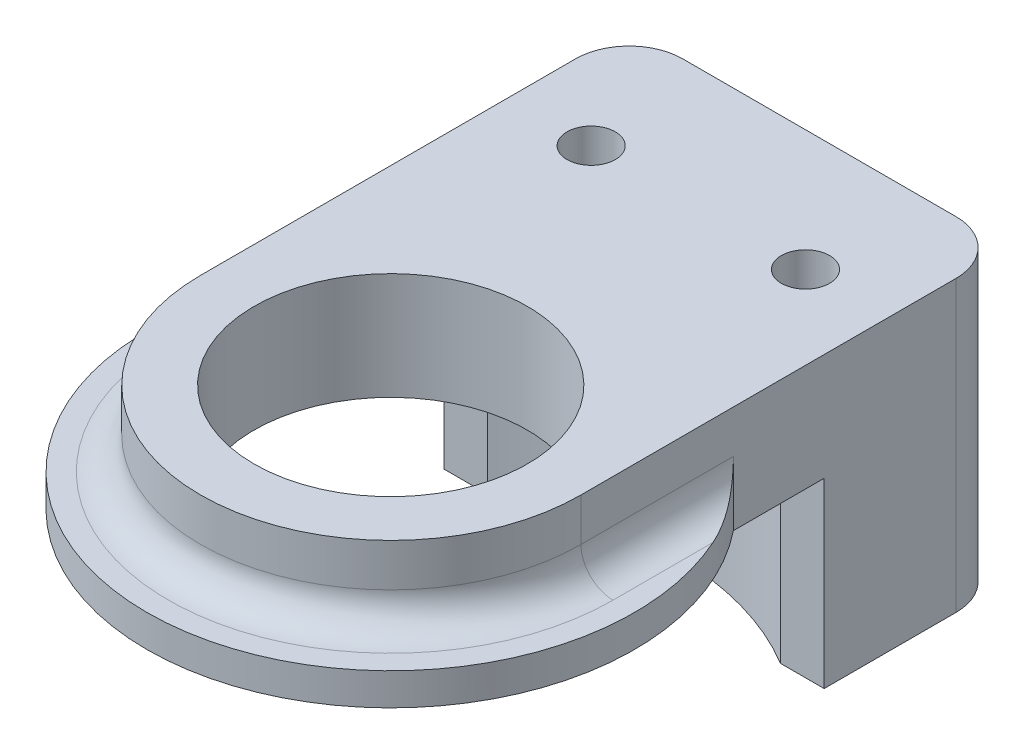
ISO-10303-21;
HEADER;
FILE_DESCRIPTION(('STEP AP214'),'2;1');
FILE_NAME('part.step','',(''),(''),'','','');
FILE_SCHEMA(('AUTOMOTIVE_DESIGN { 1 0 10303 214 1 1 1 1 }'));
ENDSEC;
DATA;
#1=APPLICATION_CONTEXT('core data for automotive mechanical design processes');
#2=APPLICATION_PROTOCOL_DEFINITION('international standard','automotive_design',2000,#1);
#3=PRODUCT_CONTEXT('',#1,'mechanical');
#4=PRODUCT('Part','Part','',(#3));
#5=PRODUCT_RELATED_PRODUCT_CATEGORY('part','',(#4));
#6=PRODUCT_DEFINITION_FORMATION('','',#4);
#7=PRODUCT_DEFINITION_CONTEXT('part definition',#1,'design');
#8=PRODUCT_DEFINITION('design','',#6,#7);
#9=PRODUCT_DEFINITION_SHAPE('','',#8);
#10=(LENGTH_UNIT() NAMED_UNIT(*) SI_UNIT(.MILLI.,.METRE.));
#11=(NAMED_UNIT(*) PLANE_ANGLE_UNIT() SI_UNIT($,.RADIAN.));
#12=(NAMED_UNIT(*) SI_UNIT($,.STERADIAN.) SOLID_ANGLE_UNIT());
#13=UNCERTAINTY_MEASURE_WITH_UNIT(LENGTH_MEASURE(1.E-05),#10,'distance_accuracy_value','');
#14=(GEOMETRIC_REPRESENTATION_CONTEXT(3) GLOBAL_UNCERTAINTY_ASSIGNED_CONTEXT((#13)) GLOBAL_UNIT_ASSIGNED_CONTEXT((#10,
#11,#12)) REPRESENTATION_CONTEXT('',''));
#15=CARTESIAN_POINT('',(0.,0.,0.));
#16=DIRECTION('',(0.,0.,1.));
#17=DIRECTION('',(1.,0.,0.));
#18=AXIS2_PLACEMENT_3D('',#15,#16,#17);
#19=CARTESIAN_POINT('',(17.75,-17.,-22.7));
#20=DIRECTION('',(0.,0.,-1.));
#21=DIRECTION('',(-1.,0.,0.));
#22=AXIS2_PLACEMENT_3D('',#19,#20,#21);
#23=PLANE('',#22);
#24=DIRECTION('',(0.,1.,0.));
#25=VECTOR('',#24,1.);
#26=CARTESIAN_POINT('',(-13.6733317081098,-30.,-22.7));
#27=LINE('',#26,#25);
#28=CARTESIAN_POINT('',(-13.6733317081098,0.,-22.7));
#29=VERTEX_POINT('',#28);
#30=CARTESIAN_POINT('',(-13.6733317081098,-17.,-22.7));
#31=VERTEX_POINT('',#30);
#32=EDGE_CURVE('E11',#29,#31,#27,.F.);
#33=ORIENTED_EDGE('',*,*,#32,.F.);
#34=DIRECTION('',(-1.,0.,0.));
#35=VECTOR('',#34,1.);
#36=CARTESIAN_POINT('',(17.75,0.,-22.7));
#37=LINE('',#36,#35);
#38=CARTESIAN_POINT('',(-17.75,0.,-22.7));
#39=VERTEX_POINT('',#38);
#40=EDGE_CURVE('E143',#29,#39,#37,.T.);
#41=ORIENTED_EDGE('',*,*,#40,.T.);
#42=DIRECTION('',(0.,1.,0.));
#43=VECTOR('',#42,1.);
#44=CARTESIAN_POINT('',(-17.75,-17.,-22.7));
#45=LINE('',#44,#43);
#46=CARTESIAN_POINT('',(-17.75,-17.,-22.7));
#47=VERTEX_POINT('',#46);
#48=EDGE_CURVE('E164',#47,#39,#45,.T.);
#49=ORIENTED_EDGE('',*,*,#48,.F.);
#50=DIRECTION('',(-1.,0.,0.));
#51=VECTOR('',#50,1.);
#52=CARTESIAN_POINT('',(17.75,-17.,-22.7));
#53=LINE('',#52,#51);
#54=EDGE_CURVE('E145',#31,#47,#53,.T.);
#55=ORIENTED_EDGE('',*,*,#54,.F.);
#56=EDGE_LOOP('',(#33,#41,#49,#55));
#57=FACE_BOUND('',#56,.T.);
#58=ADVANCED_FACE('F33',(#57),#23,.F.);
#59=DIRECTION('',(0.,1.,0.));
#60=VECTOR('',#59,1.);
#61=CARTESIAN_POINT('',(13.6733317081098,-30.,-22.7));
#62=LINE('',#61,#60);
#63=CARTESIAN_POINT('',(13.6733317081098,-17.,-22.7));
#64=VERTEX_POINT('',#63);
#65=CARTESIAN_POINT('',(13.6733317081098,0.,-22.7));
#66=VERTEX_POINT('',#65);
#67=EDGE_CURVE('E42',#64,#66,#62,.T.);
#68=ORIENTED_EDGE('',*,*,#67,.F.);
#69=CARTESIAN_POINT('',(17.75,-17.,-22.7));
#70=VERTEX_POINT('',#69);
#71=EDGE_CURVE('E355',#70,#64,#53,.T.);
#72=ORIENTED_EDGE('',*,*,#71,.F.);
#73=DIRECTION('',(0.,1.,0.));
#74=VECTOR('',#73,1.);
#75=CARTESIAN_POINT('',(17.75,-17.,-22.7));
#76=LINE('',#75,#74);
#77=CARTESIAN_POINT('',(17.75,0.,-22.7));
#78=VERTEX_POINT('',#77);
#79=EDGE_CURVE('E161',#70,#78,#76,.T.);
#80=ORIENTED_EDGE('',*,*,#79,.T.);
#81=EDGE_CURVE('E151',#78,#66,#37,.T.);
#82=ORIENTED_EDGE('',*,*,#81,.T.);
#83=EDGE_LOOP('',(#68,#72,#80,#82));
#84=FACE_BOUND('',#83,.T.);
#85=ADVANCED_FACE('F268',(#84),#23,.F.);
#86=CARTESIAN_POINT('',(0.,0.,0.));
#87=DIRECTION('',(0.,1.,0.));
#88=DIRECTION('',(0.,0.,1.));
#89=AXIS2_PLACEMENT_3D('',#86,#87,#88);
#90=PLANE('',#89);
#91=ORIENTED_EDGE('',*,*,#81,.F.);
#92=DIRECTION('',(0.,0.,-1.));
#93=VECTOR('',#92,1.);
#94=CARTESIAN_POINT('',(17.75,0.,-40.));
#95=LINE('',#94,#93);
#96=CARTESIAN_POINT('',(17.75,0.,-14.2302494707577));
#97=VERTEX_POINT('',#96);
#98=EDGE_CURVE('E57',#97,#78,#95,.T.);
#99=ORIENTED_EDGE('',*,*,#98,.F.);
#100=CARTESIAN_POINT('',(0.,0.,0.));
#101=DIRECTION('',(0.,1.,0.));
#102=DIRECTION('',(0.,0.,1.));
#103=AXIS2_PLACEMENT_3D('',#100,#101,#102);
#104=CIRCLE('',#103,22.75);
#105=CARTESIAN_POINT('',(-17.75,0.,-14.2302494707577));
#106=VERTEX_POINT('',#105);
#107=EDGE_CURVE('E202',#106,#97,#104,.T.);
#108=ORIENTED_EDGE('',*,*,#107,.F.);
#109=DIRECTION('',(0.,0.,1.));
#110=VECTOR('',#109,1.);
#111=CARTESIAN_POINT('',(-17.75,0.,-14.2302494707577));
#112=LINE('',#111,#110);
#113=EDGE_CURVE('E149',#39,#106,#112,.T.);
#114=ORIENTED_EDGE('',*,*,#113,.F.);
#115=ORIENTED_EDGE('',*,*,#40,.F.);
#116=CARTESIAN_POINT('',(0.,0.,0.));
#117=DIRECTION('',(0.,-1.,0.));
#118=DIRECTION('',(0.,0.,-1.));
#119=AXIS2_PLACEMENT_3D('',#116,#117,#118);
#120=CIRCLE('',#119,26.5);
#121=EDGE_CURVE('E49',#29,#66,#120,.T.);
#122=ORIENTED_EDGE('',*,*,#121,.T.);
#123=EDGE_LOOP('',(#91,#99,#108,#114,#115,#122));
#124=FACE_BOUND('',#123,.T.);
#125=CARTESIAN_POINT('',(0.,0.,0.));
#126=DIRECTION('',(0.,1.,0.));
#127=DIRECTION('',(0.,0.,1.));
#128=AXIS2_PLACEMENT_3D('',#125,#126,#127);
#129=CIRCLE('',#128,12.75);
#130=CARTESIAN_POINT('',(0.,0.,12.75));
#131=VERTEX_POINT('',#130);
#132=EDGE_CURVE('E199',#131,#131,#129,.T.);
#133=ORIENTED_EDGE('',*,*,#132,.T.);
#134=EDGE_LOOP('',(#133));
#135=FACE_BOUND('',#134,.T.);
#136=ADVANCED_FACE('F146',(#124,#135),#90,.F.);
#137=CARTESIAN_POINT('',(0.,3.,0.));
#138=DIRECTION('',(0.,-1.,0.));
#139=DIRECTION('',(0.,0.,-1.));
#140=AXIS2_PLACEMENT_3D('',#137,#138,#139);
#141=CYLINDRICAL_SURFACE('',#140,22.75);
#142=DIRECTION('',(0.,1.,0.));
#143=VECTOR('',#142,1.);
#144=CARTESIAN_POINT('',(-17.75,-43.8671863964329,-14.2302494707577));
#145=LINE('',#144,#143);
#146=CARTESIAN_POINT('',(-17.75,6.,-14.2302494707577));
#147=VERTEX_POINT('',#146);
#148=EDGE_CURVE('E174',#106,#147,#145,.T.);
#149=ORIENTED_EDGE('',*,*,#148,.F.);
#150=ORIENTED_EDGE('',*,*,#107,.T.);
#151=DIRECTION('',(0.,1.,0.));
#152=VECTOR('',#151,1.);
#153=CARTESIAN_POINT('',(17.75,-43.8671863964329,-14.2302494707577));
#154=LINE('',#153,#152);
#155=CARTESIAN_POINT('',(17.75,6.,-14.2302494707577));
#156=VERTEX_POINT('',#155);
#157=EDGE_CURVE('E178',#97,#156,#154,.T.);
#158=ORIENTED_EDGE('',*,*,#157,.T.);
#159=CARTESIAN_POINT('',(17.75,6.,-14.2302494707577));
#160=CARTESIAN_POINT('',(17.749982832571,5.9383510737494,-14.2302669454615));
#161=CARTESIAN_POINT('',(17.7518996997284,5.87671567791633,-14.227879815383));
#162=CARTESIAN_POINT('',(17.7594697862114,5.75408976754788,-14.2184316724263));
#163=CARTESIAN_POINT('',(17.7651196177282,5.69309871918573,-14.2113748974218));
#164=CARTESIAN_POINT('',(17.7799527086319,5.57284636395077,-14.1928120034535));
#165=CARTESIAN_POINT('',(17.7891014769365,5.51357406491429,-14.1813493108431));
#166=CARTESIAN_POINT('',(17.8107004131048,5.39662674931064,-14.1542132458299));
#167=CARTESIAN_POINT('',(17.8231511217252,5.33895199608282,-14.1385391837283));
#168=CARTESIAN_POINT('',(17.8649561093454,5.16933146938826,-14.0857323220805));
#169=CARTESIAN_POINT('',(17.8988325012663,5.06025768405964,-14.0427292391814));
#170=CARTESIAN_POINT('',(17.9761739380713,4.85181324570684,-13.9435872917327));
#171=CARTESIAN_POINT('',(18.0196633548164,4.75246819867072,-13.8874150170407));
#172=CARTESIAN_POINT('',(18.1346939575213,4.52240982796319,-13.7370953289741));
#173=CARTESIAN_POINT('',(18.2101054286948,4.39741449488044,-13.6371733513257));
#174=CARTESIAN_POINT('',(18.3696714167668,4.16872406972164,-13.4214653078766));
#175=CARTESIAN_POINT('',(18.4538387113781,4.0650607838964,-13.3056559762722));
#176=CARTESIAN_POINT('',(18.6082582337561,3.89689919783421,-13.0885089268311));
#177=CARTESIAN_POINT('',(18.6776653677985,3.82875968949249,-12.9893276778849));
#178=CARTESIAN_POINT('',(18.8178913080028,3.70308256134625,-12.7853348721969));
#179=CARTESIAN_POINT('',(18.888710960831,3.64555152566926,-12.6805198706419));
#180=CARTESIAN_POINT('',(19.0310756632719,3.53967200583893,-12.4658473224516));
#181=CARTESIAN_POINT('',(19.1026225378727,3.49137870967459,-12.3559640574223));
#182=CARTESIAN_POINT('',(19.2452490883705,3.40332142456936,-12.1326198486935));
#183=CARTESIAN_POINT('',(19.3163288699171,3.36355543765375,-12.019159750219));
#184=CARTESIAN_POINT('',(19.5123967670264,3.26353738019985,-11.6998404762969));
#185=CARTESIAN_POINT('',(19.6363091556213,3.21141170957409,-11.4907599467753));
#186=CARTESIAN_POINT('',(19.8790106134498,3.12634100217849,-11.0656028824518));
#187=CARTESIAN_POINT('',(19.9977916597655,3.09342506169637,-10.8495162555755));
#188=CARTESIAN_POINT('',(20.2261556793396,3.04383683133083,-10.4174556985862));
#189=CARTESIAN_POINT('',(20.3358910901428,3.02679322662806,-10.2016038284522));
#190=CARTESIAN_POINT('',(20.4952465094806,3.01036238725955,-9.87532168565159));
#191=CARTESIAN_POINT('',(20.5474096766541,3.00640692060637,-9.76632308398071));
#192=CARTESIAN_POINT('',(20.6500076143463,3.00122762776733,-9.54747531387159));
#193=CARTESIAN_POINT('',(20.7004427138561,3.00000327875135,-9.43762631227033));
#194=CARTESIAN_POINT('',(20.75,3.,-9.32737905308881));
#195=B_SPLINE_CURVE_WITH_KNOTS('',3,(#159,#160,#161,#162,#163,#164,#165,#166,#167,#168,#169,
#170,#171,#172,#173,#174,#175,#176,#177,#178,#179,#180,#181,#182,#183,#184,#185,#186,#187,#188,
#189,#190,#191,#192,#193,#194),.UNSPECIFIED.,.F.,.F.,(4,2,2,2,2,2,2,2,2,2,2,2,2,2,2,2,2,4),(0.,
0.184848870665858,0.369530213866661,0.552436106769401,0.735371972575143,1.09963776546167,
1.46483789416936,1.99257813598637,2.52109963072813,2.93727728248148,3.35371237100537,
3.77256252286794,4.19131442936564,4.93580328326929,5.68141688045747,6.40911404880485,
6.77178351033113,7.13438353845235),.UNSPECIFIED.);
#196=CARTESIAN_POINT('',(20.75,3.,-9.32737905308881));
#197=VERTEX_POINT('',#196);
#198=EDGE_CURVE('E242',#156,#197,#195,.T.);
#199=ORIENTED_EDGE('',*,*,#198,.T.);
#200=CARTESIAN_POINT('',(0.,3.,0.));
#201=DIRECTION('',(0.,1.,0.));
#202=DIRECTION('',(0.,0.,1.));
#203=AXIS2_PLACEMENT_3D('',#200,#201,#202);
#204=CIRCLE('',#203,22.75);
#205=CARTESIAN_POINT('',(-20.75,3.,-9.32737905308881));
#206=VERTEX_POINT('',#205);
#207=EDGE_CURVE('E203',#206,#197,#204,.T.);
#208=ORIENTED_EDGE('',*,*,#207,.F.);
#209=CARTESIAN_POINT('',(-20.75,3.,-9.32737905308881));
#210=CARTESIAN_POINT('',(-20.6984800666444,3.00000386315431,-9.4419924584073));
#211=CARTESIAN_POINT('',(-20.6460116128232,3.0013267615982,-9.55617502211884));
#212=CARTESIAN_POINT('',(-20.5392079067228,3.00693615710183,-9.78362055926346));
#213=CARTESIAN_POINT('',(-20.4848722333643,3.01122332686185,-9.8968833180555));
#214=CARTESIAN_POINT('',(-20.318717521679,3.02906492491909,-10.2360007195799));
#215=CARTESIAN_POINT('',(-20.2041506440185,3.04760455319548,-10.4602949615928));
#216=CARTESIAN_POINT('',(-19.9673492145153,3.1013195718932,-10.9055798175741));
#217=CARTESIAN_POINT('',(-19.8450520861757,3.13665154614539,-11.1265187035268));
#218=CARTESIAN_POINT('',(-19.5952510091232,3.22795595300167,-11.5607573026451));
#219=CARTESIAN_POINT('',(-19.4677573232857,3.28388930343269,-11.7740706467788));
#220=CARTESIAN_POINT('',(-19.2896969761877,3.37881828076168,-12.0614607159849));
#221=CARTESIAN_POINT('',(-19.2403715593132,3.40686140813978,-12.1399784930953));
#222=CARTESIAN_POINT('',(-19.1414898676408,3.46700829311592,-12.2952975111282));
#223=CARTESIAN_POINT('',(-19.091933582357,3.49911223691895,-12.3720986731468));
#224=CARTESIAN_POINT('',(-18.9433426737307,3.60197681929784,-12.599401790103));
#225=CARTESIAN_POINT('',(-18.8442655789628,3.67935216013198,-12.7469972443136));
#226=CARTESIAN_POINT('',(-18.6478524054714,3.8555740953784,-13.0326670541689));
#227=CARTESIAN_POINT('',(-18.5505395889558,3.95460519182029,-13.1706452609519));
#228=CARTESIAN_POINT('',(-18.3629238642731,4.17710283893815,-13.430975299167));
#229=CARTESIAN_POINT('',(-18.2726086832817,4.30052519555644,-13.5533547435135));
#230=CARTESIAN_POINT('',(-18.1322305636916,4.53057281883561,-13.7402256887281));
#231=CARTESIAN_POINT('',(-18.0785037639766,4.63004668900363,-13.8107462039368));
#232=CARTESIAN_POINT('',(-17.9802082274404,4.84163671615674,-13.9384752179157));
#233=CARTESIAN_POINT('',(-17.9356398083153,4.95375331149791,-13.9956832548969));
#234=CARTESIAN_POINT('',(-17.8779620505832,5.13089709092215,-14.0691851351284));
#235=CARTESIAN_POINT('',(-17.8601787547094,5.19187398401408,-14.09174152282));
#236=CARTESIAN_POINT('',(-17.8282462961796,5.31628265225181,-14.1321192583094));
#237=CARTESIAN_POINT('',(-17.8140949329631,5.37971291398161,-14.1499434735214));
#238=CARTESIAN_POINT('',(-17.7898331810387,5.50838046615537,-14.180434265673));
#239=CARTESIAN_POINT('',(-17.7797125803726,5.57361273649339,-14.1931138780402));
#240=CARTESIAN_POINT('',(-17.7637660902304,5.7053784799515,-14.2130672098211));
#241=CARTESIAN_POINT('',(-17.7579362614397,5.77191070183382,-14.2203458878287));
#242=CARTESIAN_POINT('',(-17.7528934220532,5.86555056378392,-14.2266397560413));
#243=CARTESIAN_POINT('',(-17.7518084703204,5.89242552698334,-14.2279934461485));
#244=CARTESIAN_POINT('',(-17.7503621003586,5.94619870451815,-14.2297978386091));
#245=CARTESIAN_POINT('',(-17.749999971893,5.97309687002327,-14.2302494273557));
#246=CARTESIAN_POINT('',(-17.75,5.99999999999999,-14.2302494707578));
#247=B_SPLINE_CURVE_WITH_KNOTS('',3,(#209,#210,#211,#212,#213,#214,#215,#216,#217,#218,#219,
#220,#221,#222,#223,#224,#225,#226,#227,#228,#229,#230,#231,#232,#233,#234,#235,#236,#237,#238,
#239,#240,#241,#242,#243,#244,#245,#246),.UNSPECIFIED.,.F.,.F.,(4,2,2,2,2,2,2,2,2,2,2,2,2,2,2,2,
2,2,4),(0.,0.376957677344208,0.754000928096872,1.51100865883082,2.27521806489393,
3.03798512016257,3.32851958426998,3.61906737539958,4.19945633776233,4.78499738336662,
5.36948706779427,5.76799626296066,6.16651927972579,6.3684728705061,6.5703038087178,
6.77162010385751,6.97275134118838,7.05352405366864,7.13421736080441),.UNSPECIFIED.);
#248=EDGE_CURVE('E234',#206,#147,#247,.T.);
#249=ORIENTED_EDGE('',*,*,#248,.T.);
#250=EDGE_LOOP('',(#149,#150,#158,#199,#208,#249));
#251=FACE_BOUND('',#250,.T.);
#252=ADVANCED_FACE('F247',(#251),#141,.T.);
#253=CARTESIAN_POINT('',(0.,3.,0.));
#254=DIRECTION('',(0.,1.,0.));
#255=DIRECTION('',(0.,0.,1.));
#256=AXIS2_PLACEMENT_3D('',#253,#254,#255);
#257=PLANE('',#256);
#258=CARTESIAN_POINT('',(0.,3.,0.));
#259=DIRECTION('',(0.,1.,0.));
#260=DIRECTION('',(0.,0.,1.));
#261=AXIS2_PLACEMENT_3D('',#258,#259,#260);
#262=CIRCLE('',#261,20.75);
#263=CARTESIAN_POINT('',(20.75,3.,0.));
#264=VERTEX_POINT('',#263);
#265=CARTESIAN_POINT('',(-20.75,3.,0.));
#266=VERTEX_POINT('',#265);
#267=EDGE_CURVE('E223',#264,#266,#262,.F.);
#268=ORIENTED_EDGE('',*,*,#267,.T.);
#269=DIRECTION('',(0.,0.,1.));
#270=VECTOR('',#269,1.);
#271=CARTESIAN_POINT('',(-20.75,3.,0.));
#272=LINE('',#271,#270);
#273=EDGE_CURVE('E227',#266,#206,#272,.F.);
#274=ORIENTED_EDGE('',*,*,#273,.T.);
#275=ORIENTED_EDGE('',*,*,#207,.T.);
#276=DIRECTION('',(0.,0.,-1.));
#277=VECTOR('',#276,1.);
#278=CARTESIAN_POINT('',(20.75,3.,0.));
#279=LINE('',#278,#277);
#280=EDGE_CURVE('E225',#197,#264,#279,.F.);
#281=ORIENTED_EDGE('',*,*,#280,.T.);
#282=EDGE_LOOP('',(#268,#274,#275,#281));
#283=FACE_BOUND('',#282,.T.);
#284=ADVANCED_FACE('F307',(#283),#257,.T.);
#285=CARTESIAN_POINT('',(0.,3.,0.));
#286=DIRECTION('',(0.,-1.,0.));
#287=DIRECTION('',(0.,0.,-1.));
#288=AXIS2_PLACEMENT_3D('',#285,#286,#287);
#289=CYLINDRICAL_SURFACE('',#288,12.75);
#290=ORIENTED_EDGE('',*,*,#132,.F.);
#291=EDGE_LOOP('',(#290));
#292=FACE_BOUND('',#291,.T.);
#293=CARTESIAN_POINT('',(0.,10.,0.));
#294=DIRECTION('',(0.,1.,0.));
#295=DIRECTION('',(0.,0.,1.));
#296=AXIS2_PLACEMENT_3D('',#293,#294,#295);
#297=CIRCLE('',#296,12.75);
#298=CARTESIAN_POINT('',(0.,10.,12.75));
#299=VERTEX_POINT('',#298);
#300=EDGE_CURVE('E176',#299,#299,#297,.T.);
#301=ORIENTED_EDGE('',*,*,#300,.T.);
#302=EDGE_LOOP('',(#301));
#303=FACE_BOUND('',#302,.T.);
#304=ADVANCED_FACE('F288',(#292,#303),#289,.F.);
#305=CARTESIAN_POINT('',(0.,10.,0.));
#306=DIRECTION('',(0.,1.,0.));
#307=DIRECTION('',(0.,0.,1.));
#308=AXIS2_PLACEMENT_3D('',#305,#306,#307);
#309=PLANE('',#308);
#310=CARTESIAN_POINT('',(-10.,10.,-28.707521000058));
#311=DIRECTION('',(0.,1.,0.));
#312=DIRECTION('',(0.,0.,1.));
#313=AXIS2_PLACEMENT_3D('',#310,#311,#312);
#314=CIRCLE('',#313,2.25);
#315=CARTESIAN_POINT('',(-10.,10.,-26.457521000058));
#316=VERTEX_POINT('',#315);
#317=EDGE_CURVE('E167',#316,#316,#314,.T.);
#318=ORIENTED_EDGE('',*,*,#317,.F.);
#319=EDGE_LOOP('',(#318));
#320=FACE_BOUND('',#319,.T.);
#321=CARTESIAN_POINT('',(10.,10.,-28.707521000058));
#322=DIRECTION('',(0.,1.,0.));
#323=DIRECTION('',(0.,0.,1.));
#324=AXIS2_PLACEMENT_3D('',#321,#322,#323);
#325=CIRCLE('',#324,2.25);
#326=CARTESIAN_POINT('',(10.,10.,-26.457521000058));
#327=VERTEX_POINT('',#326);
#328=EDGE_CURVE('E170',#327,#327,#325,.T.);
#329=ORIENTED_EDGE('',*,*,#328,.F.);
#330=EDGE_LOOP('',(#329));
#331=FACE_BOUND('',#330,.T.);
#332=DIRECTION('',(0.,0.,-1.));
#333=VECTOR('',#332,1.);
#334=CARTESIAN_POINT('',(17.75,10.,0.));
#335=LINE('',#334,#333);
#336=CARTESIAN_POINT('',(17.75,10.,0.));
#337=VERTEX_POINT('',#336);
#338=CARTESIAN_POINT('',(17.75,10.,-35.));
#339=VERTEX_POINT('',#338);
#340=EDGE_CURVE('E185',#337,#339,#335,.T.);
#341=ORIENTED_EDGE('',*,*,#340,.T.);
#342=CARTESIAN_POINT('',(12.75,10.,-35.));
#343=DIRECTION('',(0.,1.,0.));
#344=DIRECTION('',(0.,0.,1.));
#345=AXIS2_PLACEMENT_3D('',#342,#343,#344);
#346=CIRCLE('',#345,5.);
#347=CARTESIAN_POINT('',(12.75,10.,-40.));
#348=VERTEX_POINT('',#347);
#349=EDGE_CURVE('E216',#339,#348,#346,.T.);
#350=ORIENTED_EDGE('',*,*,#349,.T.);
#351=DIRECTION('',(-1.,0.,0.));
#352=VECTOR('',#351,1.);
#353=CARTESIAN_POINT('',(17.75,10.,-40.));
#354=LINE('',#353,#352);
#355=CARTESIAN_POINT('',(-12.75,10.,-40.));
#356=VERTEX_POINT('',#355);
#357=EDGE_CURVE('E188',#348,#356,#354,.T.);
#358=ORIENTED_EDGE('',*,*,#357,.T.);
#359=CARTESIAN_POINT('',(-12.75,10.,-35.));
#360=DIRECTION('',(0.,1.,0.));
#361=DIRECTION('',(0.,0.,1.));
#362=AXIS2_PLACEMENT_3D('',#359,#360,#361);
#363=CIRCLE('',#362,5.);
#364=CARTESIAN_POINT('',(-17.75,10.,-35.));
#365=VERTEX_POINT('',#364);
#366=EDGE_CURVE('E214',#356,#365,#363,.T.);
#367=ORIENTED_EDGE('',*,*,#366,.T.);
#368=DIRECTION('',(0.,0.,1.));
#369=VECTOR('',#368,1.);
#370=CARTESIAN_POINT('',(-17.75,10.,-40.));
#371=LINE('',#370,#369);
#372=CARTESIAN_POINT('',(-17.75,10.,0.));
#373=VERTEX_POINT('',#372);
#374=EDGE_CURVE('E191',#365,#373,#371,.T.);
#375=ORIENTED_EDGE('',*,*,#374,.T.);
#376=CARTESIAN_POINT('',(0.,10.,0.));
#377=DIRECTION('',(0.,1.,0.));
#378=DIRECTION('',(0.,0.,1.));
#379=AXIS2_PLACEMENT_3D('',#376,#377,#378);
#380=CIRCLE('',#379,17.75);
#381=EDGE_CURVE('E183',#373,#337,#380,.T.);
#382=ORIENTED_EDGE('',*,*,#381,.T.);
#383=EDGE_LOOP('',(#341,#350,#358,#367,#375,#382));
#384=FACE_BOUND('',#383,.T.);
#385=ORIENTED_EDGE('',*,*,#300,.F.);
#386=EDGE_LOOP('',(#385));
#387=FACE_BOUND('',#386,.T.);
#388=ADVANCED_FACE('F284',(#320,#331,#384,#387),#309,.T.);
#389=CARTESIAN_POINT('',(17.75,10.,0.));
#390=DIRECTION('',(-1.,0.,0.));
#391=DIRECTION('',(0.,0.,1.));
#392=AXIS2_PLACEMENT_3D('',#389,#390,#391);
#393=PLANE('',#392);
#394=DIRECTION('',(0.,-1.,0.));
#395=VECTOR('',#394,1.);
#396=CARTESIAN_POINT('',(17.75,10.,0.));
#397=LINE('',#396,#395);
#398=CARTESIAN_POINT('',(17.75,6.,0.));
#399=VERTEX_POINT('',#398);
#400=EDGE_CURVE('E196',#337,#399,#397,.T.);
#401=ORIENTED_EDGE('',*,*,#400,.T.);
#402=DIRECTION('',(0.,0.,-1.));
#403=VECTOR('',#402,1.);
#404=CARTESIAN_POINT('',(17.75,6.,0.));
#405=LINE('',#404,#403);
#406=EDGE_CURVE('E229',#399,#156,#405,.T.);
#407=ORIENTED_EDGE('',*,*,#406,.T.);
#408=ORIENTED_EDGE('',*,*,#157,.F.);
#409=ORIENTED_EDGE('',*,*,#98,.T.);
#410=ORIENTED_EDGE('',*,*,#79,.F.);
#411=DIRECTION('',(0.,0.,1.));
#412=VECTOR('',#411,1.);
#413=CARTESIAN_POINT('',(17.75,-17.,-35.));
#414=LINE('',#413,#412);
#415=CARTESIAN_POINT('',(17.75,-17.,-35.));
#416=VERTEX_POINT('',#415);
#417=EDGE_CURVE('E159',#416,#70,#414,.T.);
#418=ORIENTED_EDGE('',*,*,#417,.F.);
#419=DIRECTION('',(0.,-1.,0.));
#420=VECTOR('',#419,1.);
#421=CARTESIAN_POINT('',(17.75,10.,-35.));
#422=LINE('',#421,#420);
#423=EDGE_CURVE('E212',#416,#339,#422,.F.);
#424=ORIENTED_EDGE('',*,*,#423,.T.);
#425=ORIENTED_EDGE('',*,*,#340,.F.);
#426=EDGE_LOOP('',(#401,#407,#408,#409,#410,#418,#424,#425));
#427=FACE_BOUND('',#426,.T.);
#428=ADVANCED_FACE('F287',(#427),#393,.F.);
#429=CARTESIAN_POINT('',(17.75,10.,-40.));
#430=DIRECTION('',(0.,0.,1.));
#431=DIRECTION('',(1.,0.,0.));
#432=AXIS2_PLACEMENT_3D('',#429,#430,#431);
#433=PLANE('',#432);
#434=ORIENTED_EDGE('',*,*,#357,.F.);
#435=DIRECTION('',(0.,-1.,0.));
#436=VECTOR('',#435,1.);
#437=CARTESIAN_POINT('',(12.75,10.,-40.));
#438=LINE('',#437,#436);
#439=CARTESIAN_POINT('',(12.75,-17.,-40.));
#440=VERTEX_POINT('',#439);
#441=EDGE_CURVE('E210',#348,#440,#438,.T.);
#442=ORIENTED_EDGE('',*,*,#441,.T.);
#443=DIRECTION('',(1.,0.,0.));
#444=VECTOR('',#443,1.);
#445=CARTESIAN_POINT('',(-12.75,-17.,-40.));
#446=LINE('',#445,#444);
#447=CARTESIAN_POINT('',(-12.75,-17.,-40.));
#448=VERTEX_POINT('',#447);
#449=EDGE_CURVE('E350',#448,#440,#446,.T.);
#450=ORIENTED_EDGE('',*,*,#449,.F.);
#451=DIRECTION('',(0.,-1.,0.));
#452=VECTOR('',#451,1.);
#453=CARTESIAN_POINT('',(-12.75,10.,-40.));
#454=LINE('',#453,#452);
#455=EDGE_CURVE('E206',#448,#356,#454,.F.);
#456=ORIENTED_EDGE('',*,*,#455,.T.);
#457=EDGE_LOOP('',(#434,#442,#450,#456));
#458=FACE_BOUND('',#457,.T.);
#459=ADVANCED_FACE('F298',(#458),#433,.F.);
#460=CARTESIAN_POINT('',(-17.75,10.,-40.));
#461=DIRECTION('',(1.,0.,0.));
#462=DIRECTION('',(0.,0.,-1.));
#463=AXIS2_PLACEMENT_3D('',#460,#461,#462);
#464=PLANE('',#463);
#465=ORIENTED_EDGE('',*,*,#148,.T.);
#466=DIRECTION('',(0.,0.,1.));
#467=VECTOR('',#466,1.);
#468=CARTESIAN_POINT('',(-17.75,6.,-40.));
#469=LINE('',#468,#467);
#470=CARTESIAN_POINT('',(-17.75,6.,0.));
#471=VERTEX_POINT('',#470);
#472=EDGE_CURVE('E220',#147,#471,#469,.T.);
#473=ORIENTED_EDGE('',*,*,#472,.T.);
#474=DIRECTION('',(0.,-1.,0.));
#475=VECTOR('',#474,1.);
#476=CARTESIAN_POINT('',(-17.75,10.,0.));
#477=LINE('',#476,#475);
#478=EDGE_CURVE('E193',#373,#471,#477,.T.);
#479=ORIENTED_EDGE('',*,*,#478,.F.);
#480=ORIENTED_EDGE('',*,*,#374,.F.);
#481=DIRECTION('',(0.,-1.,0.));
#482=VECTOR('',#481,1.);
#483=CARTESIAN_POINT('',(-17.75,10.,-35.));
#484=LINE('',#483,#482);
#485=CARTESIAN_POINT('',(-17.75,-17.,-35.));
#486=VERTEX_POINT('',#485);
#487=EDGE_CURVE('E218',#365,#486,#484,.T.);
#488=ORIENTED_EDGE('',*,*,#487,.T.);
#489=DIRECTION('',(0.,0.,-1.));
#490=VECTOR('',#489,1.);
#491=CARTESIAN_POINT('',(-17.75,-17.,-22.7));
#492=LINE('',#491,#490);
#493=EDGE_CURVE('E351',#47,#486,#492,.T.);
#494=ORIENTED_EDGE('',*,*,#493,.F.);
#495=ORIENTED_EDGE('',*,*,#48,.T.);
#496=ORIENTED_EDGE('',*,*,#113,.T.);
#497=EDGE_LOOP('',(#465,#473,#479,#480,#488,#494,#495,#496));
#498=FACE_BOUND('',#497,.T.);
#499=ADVANCED_FACE('F294',(#498),#464,.F.);
#500=CARTESIAN_POINT('',(0.,10.,0.));
#501=DIRECTION('',(0.,-1.,0.));
#502=DIRECTION('',(0.,0.,-1.));
#503=AXIS2_PLACEMENT_3D('',#500,#501,#502);
#504=CYLINDRICAL_SURFACE('',#503,17.75);
#505=ORIENTED_EDGE('',*,*,#478,.T.);
#506=CARTESIAN_POINT('',(0.,6.,0.));
#507=DIRECTION('',(0.,1.,0.));
#508=DIRECTION('',(0.,0.,1.));
#509=AXIS2_PLACEMENT_3D('',#506,#507,#508);
#510=CIRCLE('',#509,17.75);
#511=EDGE_CURVE('E232',#471,#399,#510,.T.);
#512=ORIENTED_EDGE('',*,*,#511,.T.);
#513=ORIENTED_EDGE('',*,*,#400,.F.);
#514=ORIENTED_EDGE('',*,*,#381,.F.);
#515=EDGE_LOOP('',(#505,#512,#513,#514));
#516=FACE_BOUND('',#515,.T.);
#517=ADVANCED_FACE('F290',(#516),#504,.T.);
#518=CARTESIAN_POINT('',(12.75,10.,-35.));
#519=DIRECTION('',(0.,-1.,0.));
#520=DIRECTION('',(0.,0.,-1.));
#521=AXIS2_PLACEMENT_3D('',#518,#519,#520);
#522=CYLINDRICAL_SURFACE('',#521,5.);
#523=ORIENTED_EDGE('',*,*,#349,.F.);
#524=ORIENTED_EDGE('',*,*,#423,.F.);
#525=CARTESIAN_POINT('',(12.75,-17.,-35.));
#526=DIRECTION('',(0.,-1.,0.));
#527=DIRECTION('',(0.,0.,-1.));
#528=AXIS2_PLACEMENT_3D('',#525,#526,#527);
#529=CIRCLE('',#528,5.);
#530=EDGE_CURVE('E353',#440,#416,#529,.T.);
#531=ORIENTED_EDGE('',*,*,#530,.F.);
#532=ORIENTED_EDGE('',*,*,#441,.F.);
#533=EDGE_LOOP('',(#523,#524,#531,#532));
#534=FACE_BOUND('',#533,.T.);
#535=ADVANCED_FACE('F293',(#534),#522,.T.);
#536=CARTESIAN_POINT('',(-12.75,10.,-35.));
#537=DIRECTION('',(0.,-1.,0.));
#538=DIRECTION('',(0.,0.,-1.));
#539=AXIS2_PLACEMENT_3D('',#536,#537,#538);
#540=CYLINDRICAL_SURFACE('',#539,5.);
#541=ORIENTED_EDGE('',*,*,#366,.F.);
#542=ORIENTED_EDGE('',*,*,#455,.F.);
#543=CARTESIAN_POINT('',(-12.75,-17.,-35.));
#544=DIRECTION('',(0.,-1.,0.));
#545=DIRECTION('',(0.,0.,-1.));
#546=AXIS2_PLACEMENT_3D('',#543,#544,#545);
#547=CIRCLE('',#546,5.);
#548=EDGE_CURVE('E346',#486,#448,#547,.T.);
#549=ORIENTED_EDGE('',*,*,#548,.F.);
#550=ORIENTED_EDGE('',*,*,#487,.F.);
#551=EDGE_LOOP('',(#541,#542,#549,#550));
#552=FACE_BOUND('',#551,.T.);
#553=ADVANCED_FACE('F258',(#552),#540,.T.);
#554=CARTESIAN_POINT('',(10.,-5.,-28.707521000058));
#555=DIRECTION('',(0.,1.,0.));
#556=DIRECTION('',(0.,0.,1.));
#557=AXIS2_PLACEMENT_3D('',#554,#555,#556);
#558=CYLINDRICAL_SURFACE('',#557,2.25);
#559=ORIENTED_EDGE('',*,*,#328,.T.);
#560=EDGE_LOOP('',(#559));
#561=FACE_BOUND('',#560,.T.);
#562=CARTESIAN_POINT('',(10.,-17.,-28.707521000058));
#563=DIRECTION('',(0.,-1.,0.));
#564=DIRECTION('',(0.,0.,-1.));
#565=AXIS2_PLACEMENT_3D('',#562,#563,#564);
#566=CIRCLE('',#565,2.25);
#567=CARTESIAN_POINT('',(10.,-17.,-30.957521000058));
#568=VERTEX_POINT('',#567);
#569=EDGE_CURVE('E155',#568,#568,#566,.T.);
#570=ORIENTED_EDGE('',*,*,#569,.T.);
#571=EDGE_LOOP('',(#570));
#572=FACE_BOUND('',#571,.T.);
#573=ADVANCED_FACE('F279',(#561,#572),#558,.F.);
#574=CARTESIAN_POINT('',(-10.,-5.,-28.707521000058));
#575=DIRECTION('',(0.,1.,0.));
#576=DIRECTION('',(0.,0.,1.));
#577=AXIS2_PLACEMENT_3D('',#574,#575,#576);
#578=CYLINDRICAL_SURFACE('',#577,2.25);
#579=ORIENTED_EDGE('',*,*,#317,.T.);
#580=EDGE_LOOP('',(#579));
#581=FACE_BOUND('',#580,.T.);
#582=CARTESIAN_POINT('',(-10.,-17.,-28.707521000058));
#583=DIRECTION('',(0.,-1.,0.));
#584=DIRECTION('',(0.,0.,-1.));
#585=AXIS2_PLACEMENT_3D('',#582,#583,#584);
#586=CIRCLE('',#585,2.25);
#587=CARTESIAN_POINT('',(-10.,-17.,-30.957521000058));
#588=VERTEX_POINT('',#587);
#589=EDGE_CURVE('E152',#588,#588,#586,.T.);
#590=ORIENTED_EDGE('',*,*,#589,.T.);
#591=EDGE_LOOP('',(#590));
#592=FACE_BOUND('',#591,.T.);
#593=ADVANCED_FACE('F264',(#581,#592),#578,.F.);
#594=CARTESIAN_POINT('',(20.75,6.,0.));
#595=DIRECTION('',(0.,0.,-1.));
#596=DIRECTION('',(-1.,0.,0.));
#597=AXIS2_PLACEMENT_3D('',#594,#595,#596);
#598=CYLINDRICAL_SURFACE('',#597,3.);
#599=ORIENTED_EDGE('',*,*,#198,.F.);
#600=ORIENTED_EDGE('',*,*,#406,.F.);
#601=CARTESIAN_POINT('',(20.75,6.,0.));
#602=DIRECTION('',(0.,0.,-1.));
#603=DIRECTION('',(-1.,0.,0.));
#604=AXIS2_PLACEMENT_3D('',#601,#602,#603);
#605=CIRCLE('',#604,3.);
#606=EDGE_CURVE('E171',#264,#399,#605,.T.);
#607=ORIENTED_EDGE('',*,*,#606,.F.);
#608=ORIENTED_EDGE('',*,*,#280,.F.);
#609=EDGE_LOOP('',(#599,#600,#607,#608));
#610=FACE_BOUND('',#609,.T.);
#611=ADVANCED_FACE('F35',(#610),#598,.F.);
#612=CARTESIAN_POINT('',(0.,6.,0.));
#613=DIRECTION('',(0.,1.,0.));
#614=DIRECTION('',(0.,0.,1.));
#615=AXIS2_PLACEMENT_3D('',#612,#613,#614);
#616=TOROIDAL_SURFACE('',#615,20.75,3.);
#617=ORIENTED_EDGE('',*,*,#606,.T.);
#618=ORIENTED_EDGE('',*,*,#511,.F.);
#619=CARTESIAN_POINT('',(-20.75,6.,0.));
#620=DIRECTION('',(0.,0.,1.));
#621=DIRECTION('',(1.,0.,0.));
#622=AXIS2_PLACEMENT_3D('',#619,#620,#621);
#623=CIRCLE('',#622,3.);
#624=EDGE_CURVE('E166',#266,#471,#623,.T.);
#625=ORIENTED_EDGE('',*,*,#624,.F.);
#626=ORIENTED_EDGE('',*,*,#267,.F.);
#627=EDGE_LOOP('',(#617,#618,#625,#626));
#628=FACE_BOUND('',#627,.T.);
#629=ADVANCED_FACE('F256',(#628),#616,.F.);
#630=CARTESIAN_POINT('',(-20.75,6.,-40.));
#631=DIRECTION('',(0.,0.,1.));
#632=DIRECTION('',(1.,0.,0.));
#633=AXIS2_PLACEMENT_3D('',#630,#631,#632);
#634=CYLINDRICAL_SURFACE('',#633,3.);
#635=ORIENTED_EDGE('',*,*,#248,.F.);
#636=ORIENTED_EDGE('',*,*,#273,.F.);
#637=ORIENTED_EDGE('',*,*,#624,.T.);
#638=ORIENTED_EDGE('',*,*,#472,.F.);
#639=EDGE_LOOP('',(#635,#636,#637,#638));
#640=FACE_BOUND('',#639,.T.);
#641=ADVANCED_FACE('F251',(#640),#634,.F.);
#642=CARTESIAN_POINT('',(-12.75,-17.,-35.));
#643=DIRECTION('',(0.,-1.,0.));
#644=DIRECTION('',(0.,0.,-1.));
#645=AXIS2_PLACEMENT_3D('',#642,#643,#644);
#646=PLANE('',#645);
#647=ORIENTED_EDGE('',*,*,#589,.F.);
#648=EDGE_LOOP('',(#647));
#649=FACE_BOUND('',#648,.T.);
#650=ORIENTED_EDGE('',*,*,#71,.T.);
#651=CARTESIAN_POINT('',(0.,-17.,0.));
#652=DIRECTION('',(0.,-1.,0.));
#653=DIRECTION('',(0.,0.,-1.));
#654=AXIS2_PLACEMENT_3D('',#651,#652,#653);
#655=CIRCLE('',#654,26.5);
#656=EDGE_CURVE('E138',#64,#31,#655,.F.);
#657=ORIENTED_EDGE('',*,*,#656,.T.);
#658=ORIENTED_EDGE('',*,*,#54,.T.);
#659=ORIENTED_EDGE('',*,*,#493,.T.);
#660=ORIENTED_EDGE('',*,*,#548,.T.);
#661=ORIENTED_EDGE('',*,*,#449,.T.);
#662=ORIENTED_EDGE('',*,*,#530,.T.);
#663=ORIENTED_EDGE('',*,*,#417,.T.);
#664=EDGE_LOOP('',(#650,#657,#658,#659,#660,#661,#662,#663));
#665=FACE_BOUND('',#664,.T.);
#666=ORIENTED_EDGE('',*,*,#569,.F.);
#667=EDGE_LOOP('',(#666));
#668=FACE_BOUND('',#667,.T.);
#669=ADVANCED_FACE('F255',(#649,#665,#668),#646,.T.);
#670=CARTESIAN_POINT('',(0.,-30.,0.));
#671=DIRECTION('',(0.,1.,0.));
#672=DIRECTION('',(0.,0.,1.));
#673=AXIS2_PLACEMENT_3D('',#670,#671,#672);
#674=CYLINDRICAL_SURFACE('',#673,26.5);
#675=ORIENTED_EDGE('',*,*,#32,.T.);
#676=ORIENTED_EDGE('',*,*,#656,.F.);
#677=ORIENTED_EDGE('',*,*,#67,.T.);
#678=ORIENTED_EDGE('',*,*,#121,.F.);
#679=EDGE_LOOP('',(#675,#676,#677,#678));
#680=FACE_BOUND('',#679,.T.);
#681=ADVANCED_FACE('F134',(#680),#674,.F.);
#682=CLOSED_SHELL('',(#58,#85,#136,#252,#284,#304,#388,#428,#459,#499,#517,#535,#553,#573,#593,
#611,#629,#641,#669,#681));
#683=MANIFOLD_SOLID_BREP('B2',#682);
#684=ADVANCED_BREP_SHAPE_REPRESENTATION('',(#18,#683),#14);
#685=SHAPE_DEFINITION_REPRESENTATION(#9,#684);
ENDSEC;
END-ISO-10303-21;
